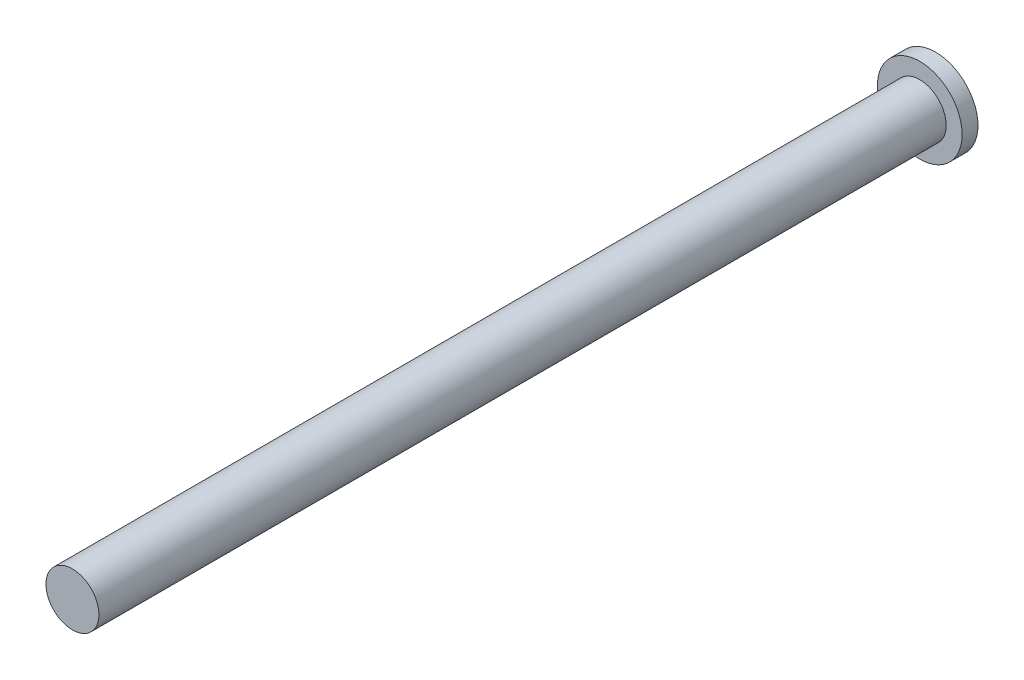
ISO-10303-21;
HEADER;
FILE_DESCRIPTION(('STEP AP214'),'2;1');
FILE_NAME('part.step','',(''),(''),'','','');
FILE_SCHEMA(('AUTOMOTIVE_DESIGN { 1 0 10303 214 1 1 1 1 }'));
ENDSEC;
DATA;
#1=APPLICATION_CONTEXT('core data for automotive mechanical design processes');
#2=APPLICATION_PROTOCOL_DEFINITION('international standard','automotive_design',2000,#1);
#3=PRODUCT_CONTEXT('',#1,'mechanical');
#4=PRODUCT('Part','Part','',(#3));
#5=PRODUCT_RELATED_PRODUCT_CATEGORY('part','',(#4));
#6=PRODUCT_DEFINITION_FORMATION('','',#4);
#7=PRODUCT_DEFINITION_CONTEXT('part definition',#1,'design');
#8=PRODUCT_DEFINITION('design','',#6,#7);
#9=PRODUCT_DEFINITION_SHAPE('','',#8);
#10=(LENGTH_UNIT() NAMED_UNIT(*) SI_UNIT(.MILLI.,.METRE.));
#11=(NAMED_UNIT(*) PLANE_ANGLE_UNIT() SI_UNIT($,.RADIAN.));
#12=(NAMED_UNIT(*) SI_UNIT($,.STERADIAN.) SOLID_ANGLE_UNIT());
#13=UNCERTAINTY_MEASURE_WITH_UNIT(LENGTH_MEASURE(1.E-05),#10,'distance_accuracy_value','');
#14=(GEOMETRIC_REPRESENTATION_CONTEXT(3) GLOBAL_UNCERTAINTY_ASSIGNED_CONTEXT((#13)) GLOBAL_UNIT_ASSIGNED_CONTEXT((#10,
#11,#12)) REPRESENTATION_CONTEXT('',''));
#15=CARTESIAN_POINT('',(0.,0.,0.));
#16=DIRECTION('',(0.,0.,1.));
#17=DIRECTION('',(1.,0.,0.));
#18=AXIS2_PLACEMENT_3D('',#15,#16,#17);
#19=CARTESIAN_POINT('',(0.,0.,1.5));
#20=DIRECTION('',(0.,0.,-1.));
#21=DIRECTION('',(-1.,0.,0.));
#22=AXIS2_PLACEMENT_3D('',#19,#20,#21);
#23=CYLINDRICAL_SURFACE('',#22,4.);
#24=CARTESIAN_POINT('',(0.,0.,1.5));
#25=DIRECTION('',(0.,0.,1.));
#26=DIRECTION('',(1.,0.,0.));
#27=AXIS2_PLACEMENT_3D('',#24,#25,#26);
#28=CIRCLE('',#27,4.);
#29=CARTESIAN_POINT('',(4.,0.,1.5));
#30=VERTEX_POINT('',#29);
#31=EDGE_CURVE('E40',#30,#30,#28,.T.);
#32=ORIENTED_EDGE('',*,*,#31,.F.);
#33=EDGE_LOOP('',(#32));
#34=FACE_BOUND('',#33,.T.);
#35=CARTESIAN_POINT('',(0.,0.,0.));
#36=DIRECTION('',(0.,0.,1.));
#37=DIRECTION('',(1.,0.,0.));
#38=AXIS2_PLACEMENT_3D('',#35,#36,#37);
#39=CIRCLE('',#38,4.);
#40=CARTESIAN_POINT('',(4.,0.,0.));
#41=VERTEX_POINT('',#40);
#42=EDGE_CURVE('E36',#41,#41,#39,.T.);
#43=ORIENTED_EDGE('',*,*,#42,.T.);
#44=EDGE_LOOP('',(#43));
#45=FACE_BOUND('',#44,.T.);
#46=ADVANCED_FACE('F33',(#34,#45),#23,.T.);
#47=CARTESIAN_POINT('',(0.,0.,1.5));
#48=DIRECTION('',(0.,0.,1.));
#49=DIRECTION('',(1.,0.,0.));
#50=AXIS2_PLACEMENT_3D('',#47,#48,#49);
#51=PLANE('',#50);
#52=CARTESIAN_POINT('',(0.,0.,1.5));
#53=DIRECTION('',(0.,0.,1.));
#54=DIRECTION('',(1.,0.,0.));
#55=AXIS2_PLACEMENT_3D('',#52,#53,#54);
#56=CIRCLE('',#55,2.5);
#57=CARTESIAN_POINT('',(2.5,0.,1.5));
#58=VERTEX_POINT('',#57);
#59=EDGE_CURVE('E10',#58,#58,#56,.T.);
#60=ORIENTED_EDGE('',*,*,#59,.F.);
#61=EDGE_LOOP('',(#60));
#62=FACE_BOUND('',#61,.T.);
#63=ORIENTED_EDGE('',*,*,#31,.T.);
#64=EDGE_LOOP('',(#63));
#65=FACE_BOUND('',#64,.T.);
#66=ADVANCED_FACE('F57',(#62,#65),#51,.T.);
#67=CARTESIAN_POINT('',(0.,0.,0.));
#68=DIRECTION('',(0.,0.,1.));
#69=DIRECTION('',(1.,0.,0.));
#70=AXIS2_PLACEMENT_3D('',#67,#68,#69);
#71=PLANE('',#70);
#72=ORIENTED_EDGE('',*,*,#42,.F.);
#73=EDGE_LOOP('',(#72));
#74=FACE_BOUND('',#73,.T.);
#75=ADVANCED_FACE('F54',(#74),#71,.F.);
#76=CARTESIAN_POINT('',(0.,0.,81.5));
#77=DIRECTION('',(0.,0.,-1.));
#78=DIRECTION('',(-1.,0.,0.));
#79=AXIS2_PLACEMENT_3D('',#76,#77,#78);
#80=CYLINDRICAL_SURFACE('',#79,2.5);
#81=CARTESIAN_POINT('',(0.,0.,81.5));
#82=DIRECTION('',(0.,0.,1.));
#83=DIRECTION('',(1.,0.,0.));
#84=AXIS2_PLACEMENT_3D('',#81,#82,#83);
#85=CIRCLE('',#84,2.5);
#86=CARTESIAN_POINT('',(2.5,0.,81.5));
#87=VERTEX_POINT('',#86);
#88=EDGE_CURVE('E46',#87,#87,#85,.T.);
#89=ORIENTED_EDGE('',*,*,#88,.F.);
#90=EDGE_LOOP('',(#89));
#91=FACE_BOUND('',#90,.T.);
#92=ORIENTED_EDGE('',*,*,#59,.T.);
#93=EDGE_LOOP('',(#92));
#94=FACE_BOUND('',#93,.T.);
#95=ADVANCED_FACE('F56',(#91,#94),#80,.T.);
#96=CARTESIAN_POINT('',(0.,0.,81.5));
#97=DIRECTION('',(0.,0.,1.));
#98=DIRECTION('',(1.,0.,0.));
#99=AXIS2_PLACEMENT_3D('',#96,#97,#98);
#100=PLANE('',#99);
#101=ORIENTED_EDGE('',*,*,#88,.T.);
#102=EDGE_LOOP('',(#101));
#103=FACE_BOUND('',#102,.T.);
#104=ADVANCED_FACE('F62',(#103),#100,.T.);
#105=CLOSED_SHELL('',(#46,#66,#75,#95,#104));
#106=MANIFOLD_SOLID_BREP('B2',#105);
#107=ADVANCED_BREP_SHAPE_REPRESENTATION('',(#18,#106),#14);
#108=SHAPE_DEFINITION_REPRESENTATION(#9,#107);
ENDSEC;
END-ISO-10303-21;
